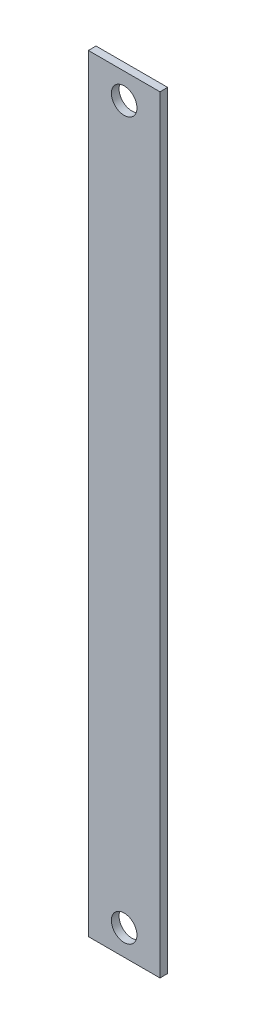
ISO-10303-21;
HEADER;
FILE_DESCRIPTION(('STEP AP214'),'2;1');
FILE_NAME('part.step','',(''),(''),'','','');
FILE_SCHEMA(('AUTOMOTIVE_DESIGN { 1 0 10303 214 1 1 1 1 }'));
ENDSEC;
DATA;
#1=APPLICATION_CONTEXT('core data for automotive mechanical design processes');
#2=APPLICATION_PROTOCOL_DEFINITION('international standard','automotive_design',2000,#1);
#3=PRODUCT_CONTEXT('',#1,'mechanical');
#4=PRODUCT('Part','Part','',(#3));
#5=PRODUCT_RELATED_PRODUCT_CATEGORY('part','',(#4));
#6=PRODUCT_DEFINITION_FORMATION('','',#4);
#7=PRODUCT_DEFINITION_CONTEXT('part definition',#1,'design');
#8=PRODUCT_DEFINITION('design','',#6,#7);
#9=PRODUCT_DEFINITION_SHAPE('','',#8);
#10=(LENGTH_UNIT() NAMED_UNIT(*) SI_UNIT(.MILLI.,.METRE.));
#11=(NAMED_UNIT(*) PLANE_ANGLE_UNIT() SI_UNIT($,.RADIAN.));
#12=(NAMED_UNIT(*) SI_UNIT($,.STERADIAN.) SOLID_ANGLE_UNIT());
#13=UNCERTAINTY_MEASURE_WITH_UNIT(LENGTH_MEASURE(1.E-05),#10,'distance_accuracy_value','');
#14=(GEOMETRIC_REPRESENTATION_CONTEXT(3) GLOBAL_UNCERTAINTY_ASSIGNED_CONTEXT((#13)) GLOBAL_UNIT_ASSIGNED_CONTEXT((#10,
#11,#12)) REPRESENTATION_CONTEXT('',''));
#15=CARTESIAN_POINT('',(0.,0.,0.));
#16=DIRECTION('',(0.,0.,1.));
#17=DIRECTION('',(1.,0.,0.));
#18=AXIS2_PLACEMENT_3D('',#15,#16,#17);
#19=CARTESIAN_POINT('',(-14.,-150.,1.5));
#20=DIRECTION('',(1.,0.,0.));
#21=DIRECTION('',(0.,0.,-1.));
#22=AXIS2_PLACEMENT_3D('',#19,#20,#21);
#23=PLANE('',#22);
#24=DIRECTION('',(0.,-1.,0.));
#25=VECTOR('',#24,1.);
#26=CARTESIAN_POINT('',(-14.,-150.,-1.5));
#27=LINE('',#26,#25);
#28=CARTESIAN_POINT('',(-14.,150.,-1.5));
#29=VERTEX_POINT('',#28);
#30=CARTESIAN_POINT('',(-14.,-150.,-1.5));
#31=VERTEX_POINT('',#30);
#32=EDGE_CURVE('E112',#29,#31,#27,.T.);
#33=ORIENTED_EDGE('',*,*,#32,.T.);
#34=DIRECTION('',(0.,0.,-1.));
#35=VECTOR('',#34,1.);
#36=CARTESIAN_POINT('',(-14.,-150.,1.5));
#37=LINE('',#36,#35);
#38=CARTESIAN_POINT('',(-14.,-150.,1.5));
#39=VERTEX_POINT('',#38);
#40=EDGE_CURVE('E11',#39,#31,#37,.T.);
#41=ORIENTED_EDGE('',*,*,#40,.F.);
#42=DIRECTION('',(0.,-1.,0.));
#43=VECTOR('',#42,1.);
#44=CARTESIAN_POINT('',(-14.,-150.,1.5));
#45=LINE('',#44,#43);
#46=CARTESIAN_POINT('',(-14.,150.,1.5));
#47=VERTEX_POINT('',#46);
#48=EDGE_CURVE('E94',#47,#39,#45,.T.);
#49=ORIENTED_EDGE('',*,*,#48,.F.);
#50=DIRECTION('',(0.,0.,-1.));
#51=VECTOR('',#50,1.);
#52=CARTESIAN_POINT('',(-14.,150.,1.5));
#53=LINE('',#52,#51);
#54=EDGE_CURVE('E108',#47,#29,#53,.T.);
#55=ORIENTED_EDGE('',*,*,#54,.T.);
#56=EDGE_LOOP('',(#33,#41,#49,#55));
#57=FACE_BOUND('',#56,.T.);
#58=ADVANCED_FACE('F42',(#57),#23,.F.);
#59=CARTESIAN_POINT('',(14.,-150.,1.5));
#60=DIRECTION('',(0.,1.,0.));
#61=DIRECTION('',(0.,0.,1.));
#62=AXIS2_PLACEMENT_3D('',#59,#60,#61);
#63=PLANE('',#62);
#64=DIRECTION('',(1.,0.,0.));
#65=VECTOR('',#64,1.);
#66=CARTESIAN_POINT('',(14.,-150.,-1.5));
#67=LINE('',#66,#65);
#68=CARTESIAN_POINT('',(14.,-150.,-1.5));
#69=VERTEX_POINT('',#68);
#70=EDGE_CURVE('E99',#31,#69,#67,.T.);
#71=ORIENTED_EDGE('',*,*,#70,.T.);
#72=DIRECTION('',(0.,0.,-1.));
#73=VECTOR('',#72,1.);
#74=CARTESIAN_POINT('',(14.,-150.,1.5));
#75=LINE('',#74,#73);
#76=CARTESIAN_POINT('',(14.,-150.,1.5));
#77=VERTEX_POINT('',#76);
#78=EDGE_CURVE('E51',#77,#69,#75,.T.);
#79=ORIENTED_EDGE('',*,*,#78,.F.);
#80=DIRECTION('',(1.,0.,0.));
#81=VECTOR('',#80,1.);
#82=CARTESIAN_POINT('',(14.,-150.,1.5));
#83=LINE('',#82,#81);
#84=EDGE_CURVE('E89',#39,#77,#83,.T.);
#85=ORIENTED_EDGE('',*,*,#84,.F.);
#86=ORIENTED_EDGE('',*,*,#40,.T.);
#87=EDGE_LOOP('',(#71,#79,#85,#86));
#88=FACE_BOUND('',#87,.T.);
#89=ADVANCED_FACE('F98',(#88),#63,.F.);
#90=CARTESIAN_POINT('',(14.,-150.,1.5));
#91=DIRECTION('',(-1.,0.,0.));
#92=DIRECTION('',(0.,0.,1.));
#93=AXIS2_PLACEMENT_3D('',#90,#91,#92);
#94=PLANE('',#93);
#95=DIRECTION('',(0.,1.,0.));
#96=VECTOR('',#95,1.);
#97=CARTESIAN_POINT('',(14.,-150.,-1.5));
#98=LINE('',#97,#96);
#99=CARTESIAN_POINT('',(14.,150.,-1.5));
#100=VERTEX_POINT('',#99);
#101=EDGE_CURVE('E76',#69,#100,#98,.T.);
#102=ORIENTED_EDGE('',*,*,#101,.T.);
#103=DIRECTION('',(0.,0.,-1.));
#104=VECTOR('',#103,1.);
#105=CARTESIAN_POINT('',(14.,150.,1.5));
#106=LINE('',#105,#104);
#107=CARTESIAN_POINT('',(14.,150.,1.5));
#108=VERTEX_POINT('',#107);
#109=EDGE_CURVE('E101',#108,#100,#106,.T.);
#110=ORIENTED_EDGE('',*,*,#109,.F.);
#111=DIRECTION('',(0.,1.,0.));
#112=VECTOR('',#111,1.);
#113=CARTESIAN_POINT('',(14.,-150.,1.5));
#114=LINE('',#113,#112);
#115=EDGE_CURVE('E92',#77,#108,#114,.T.);
#116=ORIENTED_EDGE('',*,*,#115,.F.);
#117=ORIENTED_EDGE('',*,*,#78,.T.);
#118=EDGE_LOOP('',(#102,#110,#116,#117));
#119=FACE_BOUND('',#118,.T.);
#120=ADVANCED_FACE('F102',(#119),#94,.F.);
#121=CARTESIAN_POINT('',(14.,150.,1.5));
#122=DIRECTION('',(0.,-1.,0.));
#123=DIRECTION('',(0.,0.,-1.));
#124=AXIS2_PLACEMENT_3D('',#121,#122,#123);
#125=PLANE('',#124);
#126=DIRECTION('',(-1.,0.,0.));
#127=VECTOR('',#126,1.);
#128=CARTESIAN_POINT('',(14.,150.,-1.5));
#129=LINE('',#128,#127);
#130=EDGE_CURVE('E82',#100,#29,#129,.T.);
#131=ORIENTED_EDGE('',*,*,#130,.T.);
#132=ORIENTED_EDGE('',*,*,#54,.F.);
#133=DIRECTION('',(-1.,0.,0.));
#134=VECTOR('',#133,1.);
#135=CARTESIAN_POINT('',(14.,150.,1.5));
#136=LINE('',#135,#134);
#137=EDGE_CURVE('E59',#108,#47,#136,.T.);
#138=ORIENTED_EDGE('',*,*,#137,.F.);
#139=ORIENTED_EDGE('',*,*,#109,.T.);
#140=EDGE_LOOP('',(#131,#132,#138,#139));
#141=FACE_BOUND('',#140,.T.);
#142=ADVANCED_FACE('F126',(#141),#125,.F.);
#143=CARTESIAN_POINT('',(0.,0.,1.5));
#144=DIRECTION('',(0.,0.,1.));
#145=DIRECTION('',(1.,0.,0.));
#146=AXIS2_PLACEMENT_3D('',#143,#144,#145);
#147=PLANE('',#146);
#148=CARTESIAN_POINT('',(0.,140.,1.5));
#149=DIRECTION('',(0.,0.,-1.));
#150=DIRECTION('',(-1.,0.,0.));
#151=AXIS2_PLACEMENT_3D('',#148,#149,#150);
#152=CIRCLE('',#151,5.);
#153=CARTESIAN_POINT('',(-5.,140.,1.5));
#154=VERTEX_POINT('',#153);
#155=EDGE_CURVE('E116',#154,#154,#152,.T.);
#156=ORIENTED_EDGE('',*,*,#155,.T.);
#157=EDGE_LOOP('',(#156));
#158=FACE_BOUND('',#157,.T.);
#159=CARTESIAN_POINT('',(0.,-140.,1.5));
#160=DIRECTION('',(0.,0.,-1.));
#161=DIRECTION('',(1.,0.,0.));
#162=AXIS2_PLACEMENT_3D('',#159,#160,#161);
#163=CIRCLE('',#162,5.);
#164=CARTESIAN_POINT('',(5.,-140.,1.5));
#165=VERTEX_POINT('',#164);
#166=EDGE_CURVE('E138',#165,#165,#163,.T.);
#167=ORIENTED_EDGE('',*,*,#166,.T.);
#168=EDGE_LOOP('',(#167));
#169=FACE_BOUND('',#168,.T.);
#170=ORIENTED_EDGE('',*,*,#48,.T.);
#171=ORIENTED_EDGE('',*,*,#84,.T.);
#172=ORIENTED_EDGE('',*,*,#115,.T.);
#173=ORIENTED_EDGE('',*,*,#137,.T.);
#174=EDGE_LOOP('',(#170,#171,#172,#173));
#175=FACE_BOUND('',#174,.T.);
#176=ADVANCED_FACE('F90',(#158,#169,#175),#147,.T.);
#177=CARTESIAN_POINT('',(0.,0.,-1.5));
#178=DIRECTION('',(0.,0.,1.));
#179=DIRECTION('',(1.,0.,0.));
#180=AXIS2_PLACEMENT_3D('',#177,#178,#179);
#181=PLANE('',#180);
#182=CARTESIAN_POINT('',(0.,140.,-1.5));
#183=DIRECTION('',(0.,0.,-1.));
#184=DIRECTION('',(-1.,0.,0.));
#185=AXIS2_PLACEMENT_3D('',#182,#183,#184);
#186=CIRCLE('',#185,5.);
#187=CARTESIAN_POINT('',(-5.,140.,-1.5));
#188=VERTEX_POINT('',#187);
#189=EDGE_CURVE('E141',#188,#188,#186,.T.);
#190=ORIENTED_EDGE('',*,*,#189,.F.);
#191=EDGE_LOOP('',(#190));
#192=FACE_BOUND('',#191,.T.);
#193=CARTESIAN_POINT('',(0.,-140.,-1.5));
#194=DIRECTION('',(0.,0.,-1.));
#195=DIRECTION('',(1.,0.,0.));
#196=AXIS2_PLACEMENT_3D('',#193,#194,#195);
#197=CIRCLE('',#196,5.);
#198=CARTESIAN_POINT('',(5.,-140.,-1.5));
#199=VERTEX_POINT('',#198);
#200=EDGE_CURVE('E134',#199,#199,#197,.T.);
#201=ORIENTED_EDGE('',*,*,#200,.F.);
#202=EDGE_LOOP('',(#201));
#203=FACE_BOUND('',#202,.T.);
#204=ORIENTED_EDGE('',*,*,#32,.F.);
#205=ORIENTED_EDGE('',*,*,#130,.F.);
#206=ORIENTED_EDGE('',*,*,#101,.F.);
#207=ORIENTED_EDGE('',*,*,#70,.F.);
#208=EDGE_LOOP('',(#204,#205,#206,#207));
#209=FACE_BOUND('',#208,.T.);
#210=ADVANCED_FACE('F129',(#192,#203,#209),#181,.F.);
#211=CARTESIAN_POINT('',(0.,-140.,1.5));
#212=DIRECTION('',(0.,0.,-1.));
#213=DIRECTION('',(-1.,0.,0.));
#214=AXIS2_PLACEMENT_3D('',#211,#212,#213);
#215=CYLINDRICAL_SURFACE('',#214,5.);
#216=ORIENTED_EDGE('',*,*,#166,.F.);
#217=EDGE_LOOP('',(#216));
#218=FACE_BOUND('',#217,.T.);
#219=ORIENTED_EDGE('',*,*,#200,.T.);
#220=EDGE_LOOP('',(#219));
#221=FACE_BOUND('',#220,.T.);
#222=ADVANCED_FACE('F152',(#218,#221),#215,.F.);
#223=CARTESIAN_POINT('',(0.,140.,1.5));
#224=DIRECTION('',(0.,0.,-1.));
#225=DIRECTION('',(-1.,0.,0.));
#226=AXIS2_PLACEMENT_3D('',#223,#224,#225);
#227=CYLINDRICAL_SURFACE('',#226,5.);
#228=ORIENTED_EDGE('',*,*,#155,.F.);
#229=EDGE_LOOP('',(#228));
#230=FACE_BOUND('',#229,.T.);
#231=ORIENTED_EDGE('',*,*,#189,.T.);
#232=EDGE_LOOP('',(#231));
#233=FACE_BOUND('',#232,.T.);
#234=ADVANCED_FACE('F149',(#230,#233),#227,.F.);
#235=CLOSED_SHELL('',(#58,#89,#120,#142,#176,#210,#222,#234));
#236=MANIFOLD_SOLID_BREP('B2',#235);
#237=ADVANCED_BREP_SHAPE_REPRESENTATION('',(#18,#236),#14);
#238=SHAPE_DEFINITION_REPRESENTATION(#9,#237);
ENDSEC;
END-ISO-10303-21;
